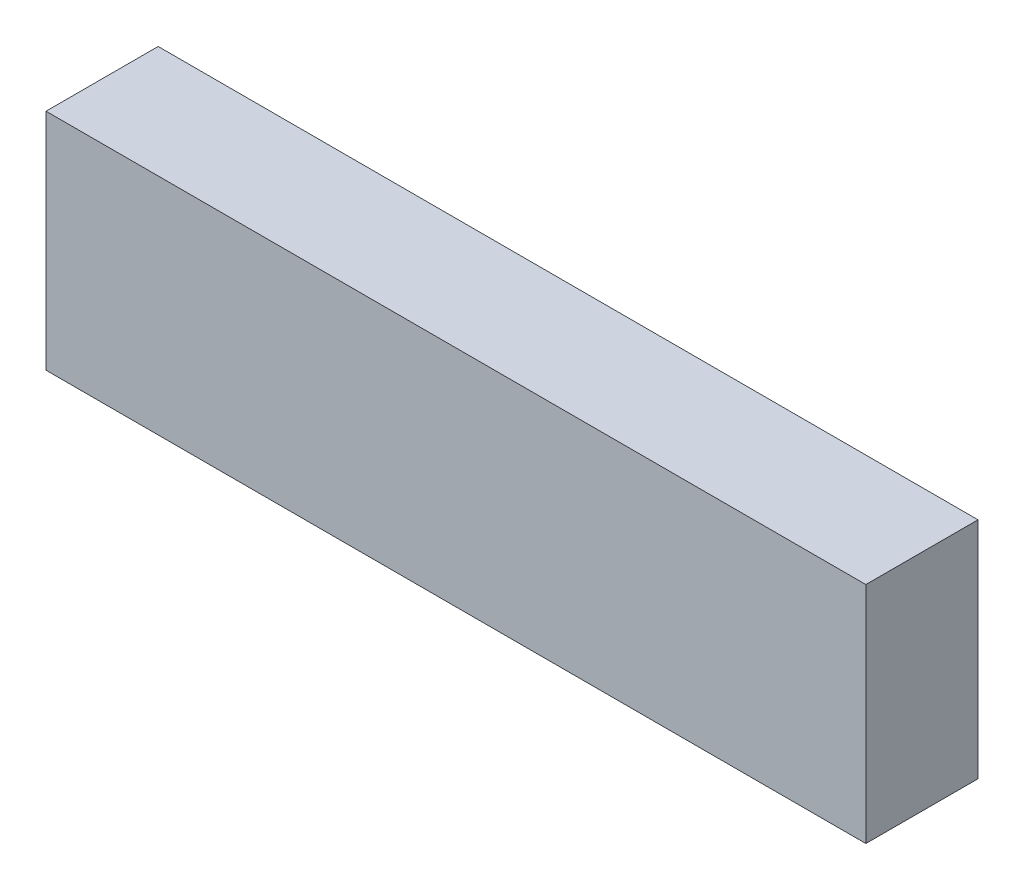
ISO-10303-21;
HEADER;
FILE_DESCRIPTION(('STEP AP214'),'2;1');
FILE_NAME('part.step','',(''),(''),'','','');
FILE_SCHEMA(('AUTOMOTIVE_DESIGN { 1 0 10303 214 1 1 1 1 }'));
ENDSEC;
DATA;
#1=APPLICATION_CONTEXT('core data for automotive mechanical design processes');
#2=APPLICATION_PROTOCOL_DEFINITION('international standard','automotive_design',2000,#1);
#3=PRODUCT_CONTEXT('',#1,'mechanical');
#4=PRODUCT('Part','Part','',(#3));
#5=PRODUCT_RELATED_PRODUCT_CATEGORY('part','',(#4));
#6=PRODUCT_DEFINITION_FORMATION('','',#4);
#7=PRODUCT_DEFINITION_CONTEXT('part definition',#1,'design');
#8=PRODUCT_DEFINITION('design','',#6,#7);
#9=PRODUCT_DEFINITION_SHAPE('','',#8);
#10=(LENGTH_UNIT() NAMED_UNIT(*) SI_UNIT(.MILLI.,.METRE.));
#11=(NAMED_UNIT(*) PLANE_ANGLE_UNIT() SI_UNIT($,.RADIAN.));
#12=(NAMED_UNIT(*) SI_UNIT($,.STERADIAN.) SOLID_ANGLE_UNIT());
#13=UNCERTAINTY_MEASURE_WITH_UNIT(LENGTH_MEASURE(1.E-05),#10,'distance_accuracy_value','');
#14=(GEOMETRIC_REPRESENTATION_CONTEXT(3) GLOBAL_UNCERTAINTY_ASSIGNED_CONTEXT((#13)) GLOBAL_UNIT_ASSIGNED_CONTEXT((#10,
#11,#12)) REPRESENTATION_CONTEXT('',''));
#15=CARTESIAN_POINT('',(0.,0.,0.));
#16=DIRECTION('',(0.,0.,1.));
#17=DIRECTION('',(1.,0.,0.));
#18=AXIS2_PLACEMENT_3D('',#15,#16,#17);
#19=CARTESIAN_POINT('',(0.,0.,-10.));
#20=DIRECTION('',(-1.,0.,0.));
#21=DIRECTION('',(0.,0.,1.));
#22=AXIS2_PLACEMENT_3D('',#19,#20,#21);
#23=PLANE('',#22);
#24=DIRECTION('',(0.,-1.,0.));
#25=VECTOR('',#24,1.);
#26=CARTESIAN_POINT('',(0.,0.,0.));
#27=LINE('',#26,#25);
#28=CARTESIAN_POINT('',(0.,20.,0.));
#29=VERTEX_POINT('',#28);
#30=CARTESIAN_POINT('',(0.,0.,0.));
#31=VERTEX_POINT('',#30);
#32=EDGE_CURVE('E107',#29,#31,#27,.T.);
#33=ORIENTED_EDGE('',*,*,#32,.F.);
#34=DIRECTION('',(0.,0.,1.));
#35=VECTOR('',#34,1.);
#36=CARTESIAN_POINT('',(0.,20.,-10.));
#37=LINE('',#36,#35);
#38=CARTESIAN_POINT('',(0.,20.,-10.));
#39=VERTEX_POINT('',#38);
#40=EDGE_CURVE('E11',#39,#29,#37,.T.);
#41=ORIENTED_EDGE('',*,*,#40,.F.);
#42=DIRECTION('',(0.,-1.,0.));
#43=VECTOR('',#42,1.);
#44=CARTESIAN_POINT('',(0.,0.,-10.));
#45=LINE('',#44,#43);
#46=CARTESIAN_POINT('',(0.,0.,-10.));
#47=VERTEX_POINT('',#46);
#48=EDGE_CURVE('E102',#39,#47,#45,.T.);
#49=ORIENTED_EDGE('',*,*,#48,.T.);
#50=DIRECTION('',(0.,0.,1.));
#51=VECTOR('',#50,1.);
#52=CARTESIAN_POINT('',(0.,0.,-10.));
#53=LINE('',#52,#51);
#54=EDGE_CURVE('E46',#47,#31,#53,.T.);
#55=ORIENTED_EDGE('',*,*,#54,.T.);
#56=EDGE_LOOP('',(#33,#41,#49,#55));
#57=FACE_BOUND('',#56,.T.);
#58=ADVANCED_FACE('F43',(#57),#23,.T.);
#59=CARTESIAN_POINT('',(0.,20.,-10.));
#60=DIRECTION('',(0.,1.,0.));
#61=DIRECTION('',(0.,0.,1.));
#62=AXIS2_PLACEMENT_3D('',#59,#60,#61);
#63=PLANE('',#62);
#64=DIRECTION('',(-1.,0.,0.));
#65=VECTOR('',#64,1.);
#66=CARTESIAN_POINT('',(0.,20.,0.));
#67=LINE('',#66,#65);
#68=CARTESIAN_POINT('',(73.1,20.,0.));
#69=VERTEX_POINT('',#68);
#70=EDGE_CURVE('E104',#69,#29,#67,.T.);
#71=ORIENTED_EDGE('',*,*,#70,.F.);
#72=DIRECTION('',(0.,0.,1.));
#73=VECTOR('',#72,1.);
#74=CARTESIAN_POINT('',(73.1,20.,-10.));
#75=LINE('',#74,#73);
#76=CARTESIAN_POINT('',(73.1,20.,-10.));
#77=VERTEX_POINT('',#76);
#78=EDGE_CURVE('E55',#77,#69,#75,.T.);
#79=ORIENTED_EDGE('',*,*,#78,.F.);
#80=DIRECTION('',(-1.,0.,0.));
#81=VECTOR('',#80,1.);
#82=CARTESIAN_POINT('',(0.,20.,-10.));
#83=LINE('',#82,#81);
#84=EDGE_CURVE('E97',#77,#39,#83,.T.);
#85=ORIENTED_EDGE('',*,*,#84,.T.);
#86=ORIENTED_EDGE('',*,*,#40,.T.);
#87=EDGE_LOOP('',(#71,#79,#85,#86));
#88=FACE_BOUND('',#87,.T.);
#89=ADVANCED_FACE('F117',(#88),#63,.T.);
#90=CARTESIAN_POINT('',(73.1,0.,-10.));
#91=DIRECTION('',(1.,0.,0.));
#92=DIRECTION('',(0.,0.,-1.));
#93=AXIS2_PLACEMENT_3D('',#90,#91,#92);
#94=PLANE('',#93);
#95=DIRECTION('',(0.,1.,0.));
#96=VECTOR('',#95,1.);
#97=CARTESIAN_POINT('',(73.1,0.,0.));
#98=LINE('',#97,#96);
#99=CARTESIAN_POINT('',(73.1,0.,0.));
#100=VERTEX_POINT('',#99);
#101=EDGE_CURVE('E93',#100,#69,#98,.T.);
#102=ORIENTED_EDGE('',*,*,#101,.F.);
#103=DIRECTION('',(0.,0.,1.));
#104=VECTOR('',#103,1.);
#105=CARTESIAN_POINT('',(73.1,0.,-10.));
#106=LINE('',#105,#104);
#107=CARTESIAN_POINT('',(73.1,0.,-10.));
#108=VERTEX_POINT('',#107);
#109=EDGE_CURVE('E88',#108,#100,#106,.T.);
#110=ORIENTED_EDGE('',*,*,#109,.F.);
#111=DIRECTION('',(0.,1.,0.));
#112=VECTOR('',#111,1.);
#113=CARTESIAN_POINT('',(73.1,0.,-10.));
#114=LINE('',#113,#112);
#115=EDGE_CURVE('E91',#108,#77,#114,.T.);
#116=ORIENTED_EDGE('',*,*,#115,.T.);
#117=ORIENTED_EDGE('',*,*,#78,.T.);
#118=EDGE_LOOP('',(#102,#110,#116,#117));
#119=FACE_BOUND('',#118,.T.);
#120=ADVANCED_FACE('F89',(#119),#94,.T.);
#121=CARTESIAN_POINT('',(0.,0.,-10.));
#122=DIRECTION('',(0.,-1.,0.));
#123=DIRECTION('',(0.,0.,-1.));
#124=AXIS2_PLACEMENT_3D('',#121,#122,#123);
#125=PLANE('',#124);
#126=DIRECTION('',(1.,0.,0.));
#127=VECTOR('',#126,1.);
#128=CARTESIAN_POINT('',(0.,0.,0.));
#129=LINE('',#128,#127);
#130=EDGE_CURVE('E110',#31,#100,#129,.T.);
#131=ORIENTED_EDGE('',*,*,#130,.F.);
#132=ORIENTED_EDGE('',*,*,#54,.F.);
#133=DIRECTION('',(1.,0.,0.));
#134=VECTOR('',#133,1.);
#135=CARTESIAN_POINT('',(0.,0.,-10.));
#136=LINE('',#135,#134);
#137=EDGE_CURVE('E100',#47,#108,#136,.T.);
#138=ORIENTED_EDGE('',*,*,#137,.T.);
#139=ORIENTED_EDGE('',*,*,#109,.T.);
#140=EDGE_LOOP('',(#131,#132,#138,#139));
#141=FACE_BOUND('',#140,.T.);
#142=ADVANCED_FACE('F99',(#141),#125,.T.);
#143=CARTESIAN_POINT('',(0.,0.,-10.));
#144=DIRECTION('',(0.,0.,-1.));
#145=DIRECTION('',(-1.,0.,0.));
#146=AXIS2_PLACEMENT_3D('',#143,#144,#145);
#147=PLANE('',#146);
#148=ORIENTED_EDGE('',*,*,#48,.F.);
#149=ORIENTED_EDGE('',*,*,#84,.F.);
#150=ORIENTED_EDGE('',*,*,#115,.F.);
#151=ORIENTED_EDGE('',*,*,#137,.F.);
#152=EDGE_LOOP('',(#148,#149,#150,#151));
#153=FACE_BOUND('',#152,.T.);
#154=ADVANCED_FACE('F96',(#153),#147,.T.);
#155=CARTESIAN_POINT('',(0.,0.,0.));
#156=DIRECTION('',(0.,0.,-1.));
#157=DIRECTION('',(-1.,0.,0.));
#158=AXIS2_PLACEMENT_3D('',#155,#156,#157);
#159=PLANE('',#158);
#160=ORIENTED_EDGE('',*,*,#32,.T.);
#161=ORIENTED_EDGE('',*,*,#130,.T.);
#162=ORIENTED_EDGE('',*,*,#101,.T.);
#163=ORIENTED_EDGE('',*,*,#70,.T.);
#164=EDGE_LOOP('',(#160,#161,#162,#163));
#165=FACE_BOUND('',#164,.T.);
#166=ADVANCED_FACE('F116',(#165),#159,.F.);
#167=CLOSED_SHELL('',(#58,#89,#120,#142,#154,#166));
#168=MANIFOLD_SOLID_BREP('B2',#167);
#169=ADVANCED_BREP_SHAPE_REPRESENTATION('',(#18,#168),#14);
#170=SHAPE_DEFINITION_REPRESENTATION(#9,#169);
ENDSEC;
END-ISO-10303-21;
